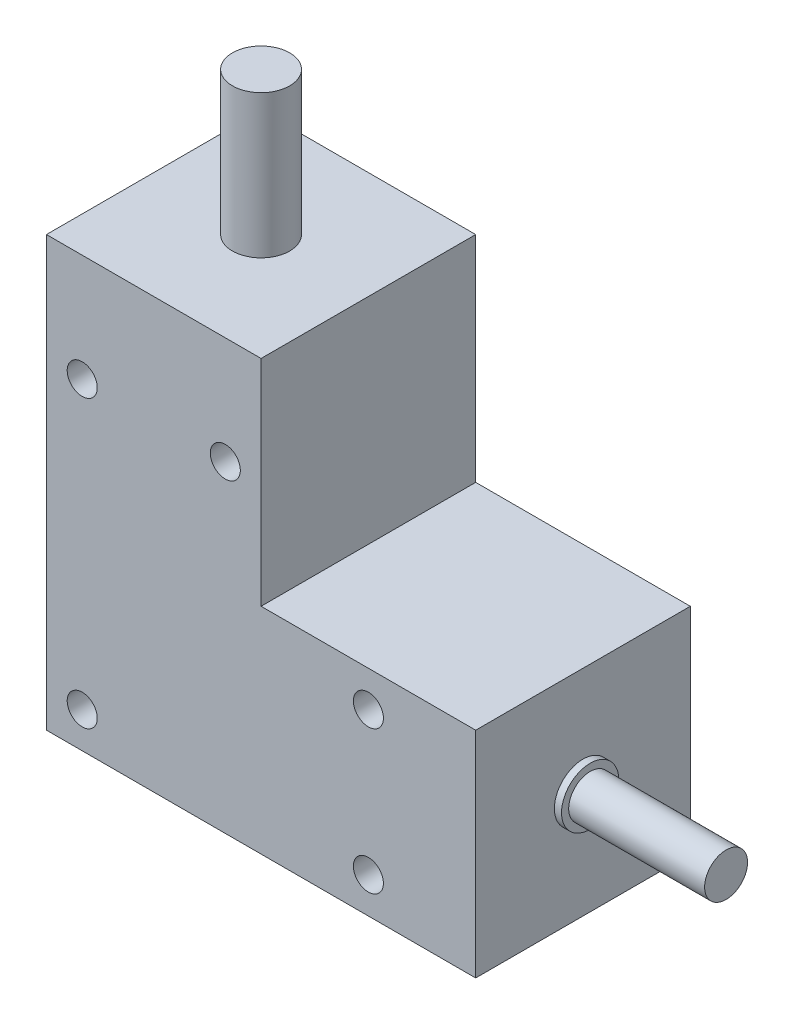
ISO-10303-21;
HEADER;
FILE_DESCRIPTION(('STEP AP214'),'2;1');
FILE_NAME('part.step','',(''),(''),'','','');
FILE_SCHEMA(('AUTOMOTIVE_DESIGN { 1 0 10303 214 1 1 1 1 }'));
ENDSEC;
DATA;
#1=APPLICATION_CONTEXT('core data for automotive mechanical design processes');
#2=APPLICATION_PROTOCOL_DEFINITION('international standard','automotive_design',2000,#1);
#3=PRODUCT_CONTEXT('',#1,'mechanical');
#4=PRODUCT('Part','Part','',(#3));
#5=PRODUCT_RELATED_PRODUCT_CATEGORY('part','',(#4));
#6=PRODUCT_DEFINITION_FORMATION('','',#4);
#7=PRODUCT_DEFINITION_CONTEXT('part definition',#1,'design');
#8=PRODUCT_DEFINITION('design','',#6,#7);
#9=PRODUCT_DEFINITION_SHAPE('','',#8);
#10=(LENGTH_UNIT() NAMED_UNIT(*) SI_UNIT(.MILLI.,.METRE.));
#11=(NAMED_UNIT(*) PLANE_ANGLE_UNIT() SI_UNIT($,.RADIAN.));
#12=(NAMED_UNIT(*) SI_UNIT($,.STERADIAN.) SOLID_ANGLE_UNIT());
#13=UNCERTAINTY_MEASURE_WITH_UNIT(LENGTH_MEASURE(1.E-05),#10,'distance_accuracy_value','');
#14=(GEOMETRIC_REPRESENTATION_CONTEXT(3) GLOBAL_UNCERTAINTY_ASSIGNED_CONTEXT((#13)) GLOBAL_UNIT_ASSIGNED_CONTEXT((#10,
#11,#12)) REPRESENTATION_CONTEXT('',''));
#15=CARTESIAN_POINT('',(0.,0.,0.));
#16=DIRECTION('',(0.,0.,1.));
#17=DIRECTION('',(1.,0.,0.));
#18=AXIS2_PLACEMENT_3D('',#15,#16,#17);
#19=CARTESIAN_POINT('',(80.,15.,0.));
#20=DIRECTION('',(-1.,0.,0.));
#21=DIRECTION('',(0.,0.,1.));
#22=AXIS2_PLACEMENT_3D('',#19,#20,#21);
#23=CYLINDRICAL_SURFACE('',#22,4.);
#24=CARTESIAN_POINT('',(60.,15.,0.));
#25=DIRECTION('',(-1.,0.,0.));
#26=DIRECTION('',(0.,0.,1.));
#27=AXIS2_PLACEMENT_3D('',#24,#25,#26);
#28=CIRCLE('',#27,4.);
#29=CARTESIAN_POINT('',(60.,15.,4.));
#30=VERTEX_POINT('',#29);
#31=EDGE_CURVE('E11',#30,#30,#28,.F.);
#32=ORIENTED_EDGE('',*,*,#31,.T.);
#33=EDGE_LOOP('',(#32));
#34=FACE_BOUND('',#33,.T.);
#35=CARTESIAN_POINT('',(61.,15.,0.));
#36=DIRECTION('',(1.,0.,0.));
#37=DIRECTION('',(0.,0.,-1.));
#38=AXIS2_PLACEMENT_3D('',#35,#36,#37);
#39=CIRCLE('',#38,4.);
#40=CARTESIAN_POINT('',(61.,15.,-4.));
#41=VERTEX_POINT('',#40);
#42=EDGE_CURVE('E267',#41,#41,#39,.T.);
#43=ORIENTED_EDGE('',*,*,#42,.F.);
#44=EDGE_LOOP('',(#43));
#45=FACE_BOUND('',#44,.T.);
#46=ADVANCED_FACE('F36',(#34,#45),#23,.T.);
#47=CARTESIAN_POINT('',(60.,30.,15.));
#48=DIRECTION('',(-1.,0.,0.));
#49=DIRECTION('',(0.,0.,1.));
#50=AXIS2_PLACEMENT_3D('',#47,#48,#49);
#51=PLANE('',#50);
#52=DIRECTION('',(0.,1.,0.));
#53=VECTOR('',#52,1.);
#54=CARTESIAN_POINT('',(60.,30.,-15.));
#55=LINE('',#54,#53);
#56=CARTESIAN_POINT('',(60.,0.,-15.));
#57=VERTEX_POINT('',#56);
#58=CARTESIAN_POINT('',(60.,30.,-15.));
#59=VERTEX_POINT('',#58);
#60=EDGE_CURVE('E131',#57,#59,#55,.T.);
#61=ORIENTED_EDGE('',*,*,#60,.T.);
#62=DIRECTION('',(0.,0.,-1.));
#63=VECTOR('',#62,1.);
#64=CARTESIAN_POINT('',(60.,30.,15.));
#65=LINE('',#64,#63);
#66=CARTESIAN_POINT('',(60.,30.,15.));
#67=VERTEX_POINT('',#66);
#68=EDGE_CURVE('E116',#67,#59,#65,.T.);
#69=ORIENTED_EDGE('',*,*,#68,.F.);
#70=DIRECTION('',(0.,1.,0.));
#71=VECTOR('',#70,1.);
#72=CARTESIAN_POINT('',(60.,30.,15.));
#73=LINE('',#72,#71);
#74=CARTESIAN_POINT('',(60.,0.,15.));
#75=VERTEX_POINT('',#74);
#76=EDGE_CURVE('E107',#75,#67,#73,.T.);
#77=ORIENTED_EDGE('',*,*,#76,.F.);
#78=DIRECTION('',(0.,0.,-1.));
#79=VECTOR('',#78,1.);
#80=CARTESIAN_POINT('',(60.,0.,15.));
#81=LINE('',#80,#79);
#82=EDGE_CURVE('E140',#75,#57,#81,.T.);
#83=ORIENTED_EDGE('',*,*,#82,.T.);
#84=EDGE_LOOP('',(#61,#69,#77,#83));
#85=FACE_BOUND('',#84,.T.);
#86=ORIENTED_EDGE('',*,*,#31,.F.);
#87=EDGE_LOOP('',(#86));
#88=FACE_BOUND('',#87,.T.);
#89=ADVANCED_FACE('F151',(#85,#88),#51,.F.);
#90=CARTESIAN_POINT('',(0.,60.,15.));
#91=DIRECTION('',(0.,-1.,0.));
#92=DIRECTION('',(0.,0.,-1.));
#93=AXIS2_PLACEMENT_3D('',#90,#91,#92);
#94=PLANE('',#93);
#95=DIRECTION('',(-1.,0.,0.));
#96=VECTOR('',#95,1.);
#97=CARTESIAN_POINT('',(0.,60.,-15.));
#98=LINE('',#97,#96);
#99=CARTESIAN_POINT('',(30.,60.,-15.));
#100=VERTEX_POINT('',#99);
#101=CARTESIAN_POINT('',(0.,60.,-15.));
#102=VERTEX_POINT('',#101);
#103=EDGE_CURVE('E83',#100,#102,#98,.T.);
#104=ORIENTED_EDGE('',*,*,#103,.T.);
#105=DIRECTION('',(0.,0.,-1.));
#106=VECTOR('',#105,1.);
#107=CARTESIAN_POINT('',(0.,60.,15.));
#108=LINE('',#107,#106);
#109=CARTESIAN_POINT('',(0.,60.,15.));
#110=VERTEX_POINT('',#109);
#111=EDGE_CURVE('E121',#110,#102,#108,.T.);
#112=ORIENTED_EDGE('',*,*,#111,.F.);
#113=DIRECTION('',(-1.,0.,0.));
#114=VECTOR('',#113,1.);
#115=CARTESIAN_POINT('',(0.,60.,15.));
#116=LINE('',#115,#114);
#117=CARTESIAN_POINT('',(30.,60.,15.));
#118=VERTEX_POINT('',#117);
#119=EDGE_CURVE('E53',#118,#110,#116,.T.);
#120=ORIENTED_EDGE('',*,*,#119,.F.);
#121=DIRECTION('',(0.,0.,-1.));
#122=VECTOR('',#121,1.);
#123=CARTESIAN_POINT('',(30.,60.,15.));
#124=LINE('',#123,#122);
#125=EDGE_CURVE('E117',#118,#100,#124,.T.);
#126=ORIENTED_EDGE('',*,*,#125,.T.);
#127=EDGE_LOOP('',(#104,#112,#120,#126));
#128=FACE_BOUND('',#127,.T.);
#129=CARTESIAN_POINT('',(15.,60.,0.));
#130=DIRECTION('',(0.,-1.,0.));
#131=DIRECTION('',(0.,0.,-1.));
#132=AXIS2_PLACEMENT_3D('',#129,#130,#131);
#133=CIRCLE('',#132,4.);
#134=CARTESIAN_POINT('',(15.,60.,-4.));
#135=VERTEX_POINT('',#134);
#136=EDGE_CURVE('E45',#135,#135,#133,.F.);
#137=ORIENTED_EDGE('',*,*,#136,.F.);
#138=EDGE_LOOP('',(#137));
#139=FACE_BOUND('',#138,.T.);
#140=ADVANCED_FACE('F149',(#128,#139),#94,.F.);
#141=CARTESIAN_POINT('',(0.,0.,15.));
#142=DIRECTION('',(1.,0.,0.));
#143=DIRECTION('',(0.,0.,-1.));
#144=AXIS2_PLACEMENT_3D('',#141,#142,#143);
#145=PLANE('',#144);
#146=DIRECTION('',(0.,-1.,0.));
#147=VECTOR('',#146,1.);
#148=CARTESIAN_POINT('',(0.,0.,-15.));
#149=LINE('',#148,#147);
#150=CARTESIAN_POINT('',(0.,0.,-15.));
#151=VERTEX_POINT('',#150);
#152=EDGE_CURVE('E125',#102,#151,#149,.T.);
#153=ORIENTED_EDGE('',*,*,#152,.T.);
#154=DIRECTION('',(0.,0.,-1.));
#155=VECTOR('',#154,1.);
#156=CARTESIAN_POINT('',(0.,0.,15.));
#157=LINE('',#156,#155);
#158=CARTESIAN_POINT('',(0.,0.,15.));
#159=VERTEX_POINT('',#158);
#160=EDGE_CURVE('E143',#159,#151,#157,.T.);
#161=ORIENTED_EDGE('',*,*,#160,.F.);
#162=DIRECTION('',(0.,-1.,0.));
#163=VECTOR('',#162,1.);
#164=CARTESIAN_POINT('',(0.,0.,15.));
#165=LINE('',#164,#163);
#166=EDGE_CURVE('E136',#110,#159,#165,.T.);
#167=ORIENTED_EDGE('',*,*,#166,.F.);
#168=ORIENTED_EDGE('',*,*,#111,.T.);
#169=EDGE_LOOP('',(#153,#161,#167,#168));
#170=FACE_BOUND('',#169,.T.);
#171=ADVANCED_FACE('F38',(#170),#145,.F.);
#172=CARTESIAN_POINT('',(60.,0.,15.));
#173=DIRECTION('',(0.,1.,0.));
#174=DIRECTION('',(-1.,0.,0.));
#175=AXIS2_PLACEMENT_3D('',#172,#173,#174);
#176=PLANE('',#175);
#177=DIRECTION('',(1.,0.,0.));
#178=VECTOR('',#177,1.);
#179=CARTESIAN_POINT('',(60.,0.,-15.));
#180=LINE('',#179,#178);
#181=EDGE_CURVE('E128',#151,#57,#180,.T.);
#182=ORIENTED_EDGE('',*,*,#181,.T.);
#183=ORIENTED_EDGE('',*,*,#82,.F.);
#184=DIRECTION('',(1.,0.,0.));
#185=VECTOR('',#184,1.);
#186=CARTESIAN_POINT('',(60.,0.,15.));
#187=LINE('',#186,#185);
#188=EDGE_CURVE('E92',#159,#75,#187,.T.);
#189=ORIENTED_EDGE('',*,*,#188,.F.);
#190=ORIENTED_EDGE('',*,*,#160,.T.);
#191=EDGE_LOOP('',(#182,#183,#189,#190));
#192=FACE_BOUND('',#191,.T.);
#193=ADVANCED_FACE('F157',(#192),#176,.F.);
#194=CARTESIAN_POINT('',(30.,30.,15.));
#195=DIRECTION('',(0.,-1.,0.));
#196=DIRECTION('',(1.,0.,0.));
#197=AXIS2_PLACEMENT_3D('',#194,#195,#196);
#198=PLANE('',#197);
#199=DIRECTION('',(-1.,0.,0.));
#200=VECTOR('',#199,1.);
#201=CARTESIAN_POINT('',(30.,30.,-15.));
#202=LINE('',#201,#200);
#203=CARTESIAN_POINT('',(30.,30.,-15.));
#204=VERTEX_POINT('',#203);
#205=EDGE_CURVE('E115',#59,#204,#202,.T.);
#206=ORIENTED_EDGE('',*,*,#205,.T.);
#207=DIRECTION('',(0.,0.,-1.));
#208=VECTOR('',#207,1.);
#209=CARTESIAN_POINT('',(30.,30.,15.));
#210=LINE('',#209,#208);
#211=CARTESIAN_POINT('',(30.,30.,15.));
#212=VERTEX_POINT('',#211);
#213=EDGE_CURVE('E112',#212,#204,#210,.T.);
#214=ORIENTED_EDGE('',*,*,#213,.F.);
#215=DIRECTION('',(-1.,0.,0.));
#216=VECTOR('',#215,1.);
#217=CARTESIAN_POINT('',(30.,30.,15.));
#218=LINE('',#217,#216);
#219=EDGE_CURVE('E101',#67,#212,#218,.T.);
#220=ORIENTED_EDGE('',*,*,#219,.F.);
#221=ORIENTED_EDGE('',*,*,#68,.T.);
#222=EDGE_LOOP('',(#206,#214,#220,#221));
#223=FACE_BOUND('',#222,.T.);
#224=ADVANCED_FACE('F113',(#223),#198,.F.);
#225=CARTESIAN_POINT('',(30.,60.,15.));
#226=DIRECTION('',(-1.,0.,0.));
#227=DIRECTION('',(0.,-1.,0.));
#228=AXIS2_PLACEMENT_3D('',#225,#226,#227);
#229=PLANE('',#228);
#230=DIRECTION('',(0.,1.,0.));
#231=VECTOR('',#230,1.);
#232=CARTESIAN_POINT('',(30.,60.,-15.));
#233=LINE('',#232,#231);
#234=EDGE_CURVE('E77',#204,#100,#233,.T.);
#235=ORIENTED_EDGE('',*,*,#234,.T.);
#236=ORIENTED_EDGE('',*,*,#125,.F.);
#237=DIRECTION('',(0.,1.,0.));
#238=VECTOR('',#237,1.);
#239=CARTESIAN_POINT('',(30.,60.,15.));
#240=LINE('',#239,#238);
#241=EDGE_CURVE('E105',#212,#118,#240,.T.);
#242=ORIENTED_EDGE('',*,*,#241,.F.);
#243=ORIENTED_EDGE('',*,*,#213,.T.);
#244=EDGE_LOOP('',(#235,#236,#242,#243));
#245=FACE_BOUND('',#244,.T.);
#246=ADVANCED_FACE('F119',(#245),#229,.F.);
#247=CARTESIAN_POINT('',(0.,60.,15.));
#248=DIRECTION('',(0.,0.,-1.));
#249=DIRECTION('',(-1.,0.,0.));
#250=AXIS2_PLACEMENT_3D('',#247,#248,#249);
#251=PLANE('',#250);
#252=CARTESIAN_POINT('',(25.,45.,15.));
#253=DIRECTION('',(0.,0.,1.));
#254=DIRECTION('',(1.,0.,0.));
#255=AXIS2_PLACEMENT_3D('',#252,#253,#254);
#256=CIRCLE('',#255,2.09999999999999);
#257=CARTESIAN_POINT('',(27.1,45.,15.));
#258=VERTEX_POINT('',#257);
#259=EDGE_CURVE('E244',#258,#258,#256,.T.);
#260=ORIENTED_EDGE('',*,*,#259,.F.);
#261=EDGE_LOOP('',(#260));
#262=FACE_BOUND('',#261,.T.);
#263=CARTESIAN_POINT('',(5.,5.,15.));
#264=DIRECTION('',(0.,0.,1.));
#265=DIRECTION('',(1.,0.,0.));
#266=AXIS2_PLACEMENT_3D('',#263,#264,#265);
#267=CIRCLE('',#266,2.09999999999999);
#268=CARTESIAN_POINT('',(7.09999999999999,5.,15.));
#269=VERTEX_POINT('',#268);
#270=EDGE_CURVE('E238',#269,#269,#267,.T.);
#271=ORIENTED_EDGE('',*,*,#270,.F.);
#272=EDGE_LOOP('',(#271));
#273=FACE_BOUND('',#272,.T.);
#274=CARTESIAN_POINT('',(5.,45.,15.));
#275=DIRECTION('',(0.,0.,1.));
#276=DIRECTION('',(1.,0.,0.));
#277=AXIS2_PLACEMENT_3D('',#274,#275,#276);
#278=CIRCLE('',#277,2.09999999999999);
#279=CARTESIAN_POINT('',(7.09999999999999,45.,15.));
#280=VERTEX_POINT('',#279);
#281=EDGE_CURVE('E232',#280,#280,#278,.T.);
#282=ORIENTED_EDGE('',*,*,#281,.F.);
#283=EDGE_LOOP('',(#282));
#284=FACE_BOUND('',#283,.T.);
#285=CARTESIAN_POINT('',(45.,25.,15.));
#286=DIRECTION('',(0.,0.,1.));
#287=DIRECTION('',(1.,0.,0.));
#288=AXIS2_PLACEMENT_3D('',#285,#286,#287);
#289=CIRCLE('',#288,2.09999999999999);
#290=CARTESIAN_POINT('',(47.1,25.,15.));
#291=VERTEX_POINT('',#290);
#292=EDGE_CURVE('E226',#291,#291,#289,.T.);
#293=ORIENTED_EDGE('',*,*,#292,.F.);
#294=EDGE_LOOP('',(#293));
#295=FACE_BOUND('',#294,.T.);
#296=CARTESIAN_POINT('',(45.,5.00000000000001,15.));
#297=DIRECTION('',(0.,0.,1.));
#298=DIRECTION('',(1.,0.,0.));
#299=AXIS2_PLACEMENT_3D('',#296,#297,#298);
#300=CIRCLE('',#299,2.09999999999999);
#301=CARTESIAN_POINT('',(47.1,5.00000000000001,15.));
#302=VERTEX_POINT('',#301);
#303=EDGE_CURVE('E220',#302,#302,#300,.T.);
#304=ORIENTED_EDGE('',*,*,#303,.F.);
#305=EDGE_LOOP('',(#304));
#306=FACE_BOUND('',#305,.T.);
#307=ORIENTED_EDGE('',*,*,#166,.T.);
#308=ORIENTED_EDGE('',*,*,#188,.T.);
#309=ORIENTED_EDGE('',*,*,#76,.T.);
#310=ORIENTED_EDGE('',*,*,#219,.T.);
#311=ORIENTED_EDGE('',*,*,#241,.T.);
#312=ORIENTED_EDGE('',*,*,#119,.T.);
#313=EDGE_LOOP('',(#307,#308,#309,#310,#311,#312));
#314=FACE_BOUND('',#313,.T.);
#315=ADVANCED_FACE('F103',(#262,#273,#284,#295,#306,#314),#251,.F.);
#316=CARTESIAN_POINT('',(0.,60.,-15.));
#317=DIRECTION('',(0.,0.,-1.));
#318=DIRECTION('',(-1.,0.,0.));
#319=AXIS2_PLACEMENT_3D('',#316,#317,#318);
#320=PLANE('',#319);
#321=CARTESIAN_POINT('',(25.,45.,-15.));
#322=DIRECTION('',(0.,0.,-1.));
#323=DIRECTION('',(-1.,0.,0.));
#324=AXIS2_PLACEMENT_3D('',#321,#322,#323);
#325=CIRCLE('',#324,2.09999999999999);
#326=CARTESIAN_POINT('',(22.9,45.,-15.));
#327=VERTEX_POINT('',#326);
#328=EDGE_CURVE('E191',#327,#327,#325,.T.);
#329=ORIENTED_EDGE('',*,*,#328,.F.);
#330=EDGE_LOOP('',(#329));
#331=FACE_BOUND('',#330,.T.);
#332=CARTESIAN_POINT('',(5.,5.,-15.));
#333=DIRECTION('',(0.,0.,-1.));
#334=DIRECTION('',(-1.,0.,0.));
#335=AXIS2_PLACEMENT_3D('',#332,#333,#334);
#336=CIRCLE('',#335,2.09999999999999);
#337=CARTESIAN_POINT('',(2.90000000000001,5.,-15.));
#338=VERTEX_POINT('',#337);
#339=EDGE_CURVE('E195',#338,#338,#336,.T.);
#340=ORIENTED_EDGE('',*,*,#339,.F.);
#341=EDGE_LOOP('',(#340));
#342=FACE_BOUND('',#341,.T.);
#343=CARTESIAN_POINT('',(5.,45.,-15.));
#344=DIRECTION('',(0.,0.,-1.));
#345=DIRECTION('',(-1.,0.,0.));
#346=AXIS2_PLACEMENT_3D('',#343,#344,#345);
#347=CIRCLE('',#346,2.09999999999999);
#348=CARTESIAN_POINT('',(2.90000000000001,45.,-15.));
#349=VERTEX_POINT('',#348);
#350=EDGE_CURVE('E199',#349,#349,#347,.T.);
#351=ORIENTED_EDGE('',*,*,#350,.F.);
#352=EDGE_LOOP('',(#351));
#353=FACE_BOUND('',#352,.T.);
#354=CARTESIAN_POINT('',(45.,25.,-15.));
#355=DIRECTION('',(0.,0.,-1.));
#356=DIRECTION('',(-1.,0.,0.));
#357=AXIS2_PLACEMENT_3D('',#354,#355,#356);
#358=CIRCLE('',#357,2.09999999999999);
#359=CARTESIAN_POINT('',(42.9,25.,-15.));
#360=VERTEX_POINT('',#359);
#361=EDGE_CURVE('E203',#360,#360,#358,.T.);
#362=ORIENTED_EDGE('',*,*,#361,.F.);
#363=EDGE_LOOP('',(#362));
#364=FACE_BOUND('',#363,.T.);
#365=CARTESIAN_POINT('',(45.,5.00000000000001,-15.));
#366=DIRECTION('',(0.,0.,-1.));
#367=DIRECTION('',(-1.,0.,0.));
#368=AXIS2_PLACEMENT_3D('',#365,#366,#367);
#369=CIRCLE('',#368,2.09999999999999);
#370=CARTESIAN_POINT('',(42.9,5.00000000000001,-15.));
#371=VERTEX_POINT('',#370);
#372=EDGE_CURVE('E207',#371,#371,#369,.T.);
#373=ORIENTED_EDGE('',*,*,#372,.F.);
#374=EDGE_LOOP('',(#373));
#375=FACE_BOUND('',#374,.T.);
#376=ORIENTED_EDGE('',*,*,#152,.F.);
#377=ORIENTED_EDGE('',*,*,#103,.F.);
#378=ORIENTED_EDGE('',*,*,#234,.F.);
#379=ORIENTED_EDGE('',*,*,#205,.F.);
#380=ORIENTED_EDGE('',*,*,#60,.F.);
#381=ORIENTED_EDGE('',*,*,#181,.F.);
#382=EDGE_LOOP('',(#376,#377,#378,#379,#380,#381));
#383=FACE_BOUND('',#382,.T.);
#384=ADVANCED_FACE('F180',(#331,#342,#353,#364,#375,#383),#320,.T.);
#385=CARTESIAN_POINT('',(15.,80.,0.));
#386=DIRECTION('',(0.,-1.,0.));
#387=DIRECTION('',(0.,0.,-1.));
#388=AXIS2_PLACEMENT_3D('',#385,#386,#387);
#389=CYLINDRICAL_SURFACE('',#388,4.);
#390=CARTESIAN_POINT('',(15.,80.,0.));
#391=DIRECTION('',(0.,1.,0.));
#392=DIRECTION('',(0.,0.,1.));
#393=AXIS2_PLACEMENT_3D('',#390,#391,#392);
#394=CIRCLE('',#393,4.);
#395=CARTESIAN_POINT('',(15.,80.,4.));
#396=VERTEX_POINT('',#395);
#397=EDGE_CURVE('E129',#396,#396,#394,.T.);
#398=ORIENTED_EDGE('',*,*,#397,.F.);
#399=EDGE_LOOP('',(#398));
#400=FACE_BOUND('',#399,.T.);
#401=ORIENTED_EDGE('',*,*,#136,.T.);
#402=EDGE_LOOP('',(#401));
#403=FACE_BOUND('',#402,.T.);
#404=ADVANCED_FACE('F147',(#400,#403),#389,.T.);
#405=CARTESIAN_POINT('',(15.,80.,0.));
#406=DIRECTION('',(0.,1.,0.));
#407=DIRECTION('',(0.,0.,1.));
#408=AXIS2_PLACEMENT_3D('',#405,#406,#407);
#409=PLANE('',#408);
#410=ORIENTED_EDGE('',*,*,#397,.T.);
#411=EDGE_LOOP('',(#410));
#412=FACE_BOUND('',#411,.T.);
#413=ADVANCED_FACE('F173',(#412),#409,.T.);
#414=CARTESIAN_POINT('',(45.,5.00000000000001,8.));
#415=DIRECTION('',(0.,0.,1.));
#416=DIRECTION('',(1.,0.,0.));
#417=AXIS2_PLACEMENT_3D('',#414,#415,#416);
#418=CONICAL_SURFACE('',#417,2.1,1.02974425867665);
#419=CARTESIAN_POINT('',(45.,5.00000000000001,6.73819270004212));
#420=VERTEX_POINT('',#419);
#421=VERTEX_LOOP('',#420);
#422=FACE_BOUND('',#421,.T.);
#423=CARTESIAN_POINT('',(45.,5.00000000000001,8.));
#424=DIRECTION('',(0.,0.,1.));
#425=DIRECTION('',(1.,0.,0.));
#426=AXIS2_PLACEMENT_3D('',#423,#424,#425);
#427=CIRCLE('',#426,2.1);
#428=CARTESIAN_POINT('',(47.1,5.00000000000001,8.));
#429=VERTEX_POINT('',#428);
#430=EDGE_CURVE('E217',#429,#429,#427,.T.);
#431=ORIENTED_EDGE('',*,*,#430,.T.);
#432=EDGE_LOOP('',(#431));
#433=FACE_BOUND('',#432,.T.);
#434=ADVANCED_FACE('F176',(#422,#433),#418,.F.);
#435=CARTESIAN_POINT('',(45.,5.00000000000001,15.));
#436=DIRECTION('',(0.,0.,1.));
#437=DIRECTION('',(1.,0.,0.));
#438=AXIS2_PLACEMENT_3D('',#435,#436,#437);
#439=CYLINDRICAL_SURFACE('',#438,2.09999999999999);
#440=ORIENTED_EDGE('',*,*,#430,.F.);
#441=EDGE_LOOP('',(#440));
#442=FACE_BOUND('',#441,.T.);
#443=ORIENTED_EDGE('',*,*,#303,.T.);
#444=EDGE_LOOP('',(#443));
#445=FACE_BOUND('',#444,.T.);
#446=ADVANCED_FACE('F361',(#442,#445),#439,.F.);
#447=CARTESIAN_POINT('',(45.,25.,8.));
#448=DIRECTION('',(0.,0.,1.));
#449=DIRECTION('',(1.,0.,0.));
#450=AXIS2_PLACEMENT_3D('',#447,#448,#449);
#451=CONICAL_SURFACE('',#450,2.1,1.02974425867665);
#452=CARTESIAN_POINT('',(45.,25.,6.73819270004212));
#453=VERTEX_POINT('',#452);
#454=VERTEX_LOOP('',#453);
#455=FACE_BOUND('',#454,.T.);
#456=CARTESIAN_POINT('',(45.,25.,8.));
#457=DIRECTION('',(0.,0.,1.));
#458=DIRECTION('',(1.,0.,0.));
#459=AXIS2_PLACEMENT_3D('',#456,#457,#458);
#460=CIRCLE('',#459,2.1);
#461=CARTESIAN_POINT('',(47.1,25.,8.));
#462=VERTEX_POINT('',#461);
#463=EDGE_CURVE('E223',#462,#462,#460,.T.);
#464=ORIENTED_EDGE('',*,*,#463,.T.);
#465=EDGE_LOOP('',(#464));
#466=FACE_BOUND('',#465,.T.);
#467=ADVANCED_FACE('F357',(#455,#466),#451,.F.);
#468=CARTESIAN_POINT('',(45.,25.,15.));
#469=DIRECTION('',(0.,0.,1.));
#470=DIRECTION('',(1.,0.,0.));
#471=AXIS2_PLACEMENT_3D('',#468,#469,#470);
#472=CYLINDRICAL_SURFACE('',#471,2.09999999999999);
#473=ORIENTED_EDGE('',*,*,#463,.F.);
#474=EDGE_LOOP('',(#473));
#475=FACE_BOUND('',#474,.T.);
#476=ORIENTED_EDGE('',*,*,#292,.T.);
#477=EDGE_LOOP('',(#476));
#478=FACE_BOUND('',#477,.T.);
#479=ADVANCED_FACE('F353',(#475,#478),#472,.F.);
#480=CARTESIAN_POINT('',(5.,45.,8.));
#481=DIRECTION('',(0.,0.,1.));
#482=DIRECTION('',(1.,0.,0.));
#483=AXIS2_PLACEMENT_3D('',#480,#481,#482);
#484=CONICAL_SURFACE('',#483,2.1,1.02974425867665);
#485=CARTESIAN_POINT('',(5.,45.,6.73819270004212));
#486=VERTEX_POINT('',#485);
#487=VERTEX_LOOP('',#486);
#488=FACE_BOUND('',#487,.T.);
#489=CARTESIAN_POINT('',(5.,45.,8.));
#490=DIRECTION('',(0.,0.,1.));
#491=DIRECTION('',(1.,0.,0.));
#492=AXIS2_PLACEMENT_3D('',#489,#490,#491);
#493=CIRCLE('',#492,2.1);
#494=CARTESIAN_POINT('',(7.1,45.,8.));
#495=VERTEX_POINT('',#494);
#496=EDGE_CURVE('E229',#495,#495,#493,.T.);
#497=ORIENTED_EDGE('',*,*,#496,.T.);
#498=EDGE_LOOP('',(#497));
#499=FACE_BOUND('',#498,.T.);
#500=ADVANCED_FACE('F349',(#488,#499),#484,.F.);
#501=CARTESIAN_POINT('',(5.,45.,15.));
#502=DIRECTION('',(0.,0.,1.));
#503=DIRECTION('',(1.,0.,0.));
#504=AXIS2_PLACEMENT_3D('',#501,#502,#503);
#505=CYLINDRICAL_SURFACE('',#504,2.09999999999999);
#506=ORIENTED_EDGE('',*,*,#496,.F.);
#507=EDGE_LOOP('',(#506));
#508=FACE_BOUND('',#507,.T.);
#509=ORIENTED_EDGE('',*,*,#281,.T.);
#510=EDGE_LOOP('',(#509));
#511=FACE_BOUND('',#510,.T.);
#512=ADVANCED_FACE('F345',(#508,#511),#505,.F.);
#513=CARTESIAN_POINT('',(5.,5.,8.));
#514=DIRECTION('',(0.,0.,1.));
#515=DIRECTION('',(1.,0.,0.));
#516=AXIS2_PLACEMENT_3D('',#513,#514,#515);
#517=CONICAL_SURFACE('',#516,2.1,1.02974425867665);
#518=CARTESIAN_POINT('',(5.,5.,6.73819270004212));
#519=VERTEX_POINT('',#518);
#520=VERTEX_LOOP('',#519);
#521=FACE_BOUND('',#520,.T.);
#522=CARTESIAN_POINT('',(5.,5.,8.));
#523=DIRECTION('',(0.,0.,1.));
#524=DIRECTION('',(1.,0.,0.));
#525=AXIS2_PLACEMENT_3D('',#522,#523,#524);
#526=CIRCLE('',#525,2.1);
#527=CARTESIAN_POINT('',(7.1,5.,8.));
#528=VERTEX_POINT('',#527);
#529=EDGE_CURVE('E235',#528,#528,#526,.T.);
#530=ORIENTED_EDGE('',*,*,#529,.T.);
#531=EDGE_LOOP('',(#530));
#532=FACE_BOUND('',#531,.T.);
#533=ADVANCED_FACE('F341',(#521,#532),#517,.F.);
#534=CARTESIAN_POINT('',(5.,5.,15.));
#535=DIRECTION('',(0.,0.,1.));
#536=DIRECTION('',(1.,0.,0.));
#537=AXIS2_PLACEMENT_3D('',#534,#535,#536);
#538=CYLINDRICAL_SURFACE('',#537,2.09999999999999);
#539=ORIENTED_EDGE('',*,*,#529,.F.);
#540=EDGE_LOOP('',(#539));
#541=FACE_BOUND('',#540,.T.);
#542=ORIENTED_EDGE('',*,*,#270,.T.);
#543=EDGE_LOOP('',(#542));
#544=FACE_BOUND('',#543,.T.);
#545=ADVANCED_FACE('F337',(#541,#544),#538,.F.);
#546=CARTESIAN_POINT('',(25.,45.,8.));
#547=DIRECTION('',(0.,0.,1.));
#548=DIRECTION('',(1.,0.,0.));
#549=AXIS2_PLACEMENT_3D('',#546,#547,#548);
#550=CONICAL_SURFACE('',#549,2.1,1.02974425867665);
#551=CARTESIAN_POINT('',(25.,45.,6.73819270004212));
#552=VERTEX_POINT('',#551);
#553=VERTEX_LOOP('',#552);
#554=FACE_BOUND('',#553,.T.);
#555=CARTESIAN_POINT('',(25.,45.,8.));
#556=DIRECTION('',(0.,0.,1.));
#557=DIRECTION('',(1.,0.,0.));
#558=AXIS2_PLACEMENT_3D('',#555,#556,#557);
#559=CIRCLE('',#558,2.1);
#560=CARTESIAN_POINT('',(27.1,45.,8.));
#561=VERTEX_POINT('',#560);
#562=EDGE_CURVE('E241',#561,#561,#559,.T.);
#563=ORIENTED_EDGE('',*,*,#562,.T.);
#564=EDGE_LOOP('',(#563));
#565=FACE_BOUND('',#564,.T.);
#566=ADVANCED_FACE('F333',(#554,#565),#550,.F.);
#567=CARTESIAN_POINT('',(25.,45.,15.));
#568=DIRECTION('',(0.,0.,1.));
#569=DIRECTION('',(1.,0.,0.));
#570=AXIS2_PLACEMENT_3D('',#567,#568,#569);
#571=CYLINDRICAL_SURFACE('',#570,2.09999999999999);
#572=ORIENTED_EDGE('',*,*,#562,.F.);
#573=EDGE_LOOP('',(#572));
#574=FACE_BOUND('',#573,.T.);
#575=ORIENTED_EDGE('',*,*,#259,.T.);
#576=EDGE_LOOP('',(#575));
#577=FACE_BOUND('',#576,.T.);
#578=ADVANCED_FACE('F329',(#574,#577),#571,.F.);
#579=CARTESIAN_POINT('',(45.,5.00000000000001,-8.));
#580=DIRECTION('',(0.,0.,-1.));
#581=DIRECTION('',(-1.,0.,0.));
#582=AXIS2_PLACEMENT_3D('',#579,#580,#581);
#583=CONICAL_SURFACE('',#582,2.1,1.02974425867665);
#584=CARTESIAN_POINT('',(45.,5.00000000000001,-6.73819270004212));
#585=VERTEX_POINT('',#584);
#586=VERTEX_LOOP('',#585);
#587=FACE_BOUND('',#586,.T.);
#588=CARTESIAN_POINT('',(45.,5.00000000000001,-8.));
#589=DIRECTION('',(0.,0.,-1.));
#590=DIRECTION('',(-1.,0.,0.));
#591=AXIS2_PLACEMENT_3D('',#588,#589,#590);
#592=CIRCLE('',#591,2.1);
#593=CARTESIAN_POINT('',(42.9,5.00000000000001,-8.));
#594=VERTEX_POINT('',#593);
#595=EDGE_CURVE('E247',#594,#594,#592,.T.);
#596=ORIENTED_EDGE('',*,*,#595,.T.);
#597=EDGE_LOOP('',(#596));
#598=FACE_BOUND('',#597,.T.);
#599=ADVANCED_FACE('F325',(#587,#598),#583,.F.);
#600=CARTESIAN_POINT('',(45.,5.00000000000001,-15.));
#601=DIRECTION('',(0.,0.,-1.));
#602=DIRECTION('',(-1.,0.,0.));
#603=AXIS2_PLACEMENT_3D('',#600,#601,#602);
#604=CYLINDRICAL_SURFACE('',#603,2.09999999999999);
#605=ORIENTED_EDGE('',*,*,#595,.F.);
#606=EDGE_LOOP('',(#605));
#607=FACE_BOUND('',#606,.T.);
#608=ORIENTED_EDGE('',*,*,#372,.T.);
#609=EDGE_LOOP('',(#608));
#610=FACE_BOUND('',#609,.T.);
#611=ADVANCED_FACE('F321',(#607,#610),#604,.F.);
#612=CARTESIAN_POINT('',(45.,25.,-8.));
#613=DIRECTION('',(0.,0.,-1.));
#614=DIRECTION('',(-1.,0.,0.));
#615=AXIS2_PLACEMENT_3D('',#612,#613,#614);
#616=CONICAL_SURFACE('',#615,2.1,1.02974425867665);
#617=CARTESIAN_POINT('',(45.,25.,-6.73819270004212));
#618=VERTEX_POINT('',#617);
#619=VERTEX_LOOP('',#618);
#620=FACE_BOUND('',#619,.T.);
#621=CARTESIAN_POINT('',(45.,25.,-8.));
#622=DIRECTION('',(0.,0.,-1.));
#623=DIRECTION('',(-1.,0.,0.));
#624=AXIS2_PLACEMENT_3D('',#621,#622,#623);
#625=CIRCLE('',#624,2.1);
#626=CARTESIAN_POINT('',(42.9,25.,-8.));
#627=VERTEX_POINT('',#626);
#628=EDGE_CURVE('E251',#627,#627,#625,.T.);
#629=ORIENTED_EDGE('',*,*,#628,.T.);
#630=EDGE_LOOP('',(#629));
#631=FACE_BOUND('',#630,.T.);
#632=ADVANCED_FACE('F317',(#620,#631),#616,.F.);
#633=CARTESIAN_POINT('',(45.,25.,-15.));
#634=DIRECTION('',(0.,0.,-1.));
#635=DIRECTION('',(-1.,0.,0.));
#636=AXIS2_PLACEMENT_3D('',#633,#634,#635);
#637=CYLINDRICAL_SURFACE('',#636,2.09999999999999);
#638=ORIENTED_EDGE('',*,*,#628,.F.);
#639=EDGE_LOOP('',(#638));
#640=FACE_BOUND('',#639,.T.);
#641=ORIENTED_EDGE('',*,*,#361,.T.);
#642=EDGE_LOOP('',(#641));
#643=FACE_BOUND('',#642,.T.);
#644=ADVANCED_FACE('F313',(#640,#643),#637,.F.);
#645=CARTESIAN_POINT('',(5.,45.,-8.));
#646=DIRECTION('',(0.,0.,-1.));
#647=DIRECTION('',(-1.,0.,0.));
#648=AXIS2_PLACEMENT_3D('',#645,#646,#647);
#649=CONICAL_SURFACE('',#648,2.1,1.02974425867665);
#650=CARTESIAN_POINT('',(5.,45.,-6.73819270004212));
#651=VERTEX_POINT('',#650);
#652=VERTEX_LOOP('',#651);
#653=FACE_BOUND('',#652,.T.);
#654=CARTESIAN_POINT('',(5.,45.,-8.));
#655=DIRECTION('',(0.,0.,-1.));
#656=DIRECTION('',(-1.,0.,0.));
#657=AXIS2_PLACEMENT_3D('',#654,#655,#656);
#658=CIRCLE('',#657,2.1);
#659=CARTESIAN_POINT('',(2.9,45.,-8.));
#660=VERTEX_POINT('',#659);
#661=EDGE_CURVE('E255',#660,#660,#658,.T.);
#662=ORIENTED_EDGE('',*,*,#661,.T.);
#663=EDGE_LOOP('',(#662));
#664=FACE_BOUND('',#663,.T.);
#665=ADVANCED_FACE('F309',(#653,#664),#649,.F.);
#666=CARTESIAN_POINT('',(5.,45.,-15.));
#667=DIRECTION('',(0.,0.,-1.));
#668=DIRECTION('',(-1.,0.,0.));
#669=AXIS2_PLACEMENT_3D('',#666,#667,#668);
#670=CYLINDRICAL_SURFACE('',#669,2.09999999999999);
#671=ORIENTED_EDGE('',*,*,#661,.F.);
#672=EDGE_LOOP('',(#671));
#673=FACE_BOUND('',#672,.T.);
#674=ORIENTED_EDGE('',*,*,#350,.T.);
#675=EDGE_LOOP('',(#674));
#676=FACE_BOUND('',#675,.T.);
#677=ADVANCED_FACE('F305',(#673,#676),#670,.F.);
#678=CARTESIAN_POINT('',(5.,5.,-8.));
#679=DIRECTION('',(0.,0.,-1.));
#680=DIRECTION('',(-1.,0.,0.));
#681=AXIS2_PLACEMENT_3D('',#678,#679,#680);
#682=CONICAL_SURFACE('',#681,2.1,1.02974425867665);
#683=CARTESIAN_POINT('',(5.,5.,-6.73819270004212));
#684=VERTEX_POINT('',#683);
#685=VERTEX_LOOP('',#684);
#686=FACE_BOUND('',#685,.T.);
#687=CARTESIAN_POINT('',(5.,5.,-8.));
#688=DIRECTION('',(0.,0.,-1.));
#689=DIRECTION('',(-1.,0.,0.));
#690=AXIS2_PLACEMENT_3D('',#687,#688,#689);
#691=CIRCLE('',#690,2.1);
#692=CARTESIAN_POINT('',(2.9,5.,-8.));
#693=VERTEX_POINT('',#692);
#694=EDGE_CURVE('E259',#693,#693,#691,.T.);
#695=ORIENTED_EDGE('',*,*,#694,.T.);
#696=EDGE_LOOP('',(#695));
#697=FACE_BOUND('',#696,.T.);
#698=ADVANCED_FACE('F301',(#686,#697),#682,.F.);
#699=CARTESIAN_POINT('',(5.,5.,-15.));
#700=DIRECTION('',(0.,0.,-1.));
#701=DIRECTION('',(-1.,0.,0.));
#702=AXIS2_PLACEMENT_3D('',#699,#700,#701);
#703=CYLINDRICAL_SURFACE('',#702,2.09999999999999);
#704=ORIENTED_EDGE('',*,*,#694,.F.);
#705=EDGE_LOOP('',(#704));
#706=FACE_BOUND('',#705,.T.);
#707=ORIENTED_EDGE('',*,*,#339,.T.);
#708=EDGE_LOOP('',(#707));
#709=FACE_BOUND('',#708,.T.);
#710=ADVANCED_FACE('F297',(#706,#709),#703,.F.);
#711=CARTESIAN_POINT('',(25.,45.,-8.));
#712=DIRECTION('',(0.,0.,-1.));
#713=DIRECTION('',(-1.,0.,0.));
#714=AXIS2_PLACEMENT_3D('',#711,#712,#713);
#715=CONICAL_SURFACE('',#714,2.1,1.02974425867665);
#716=CARTESIAN_POINT('',(25.,45.,-6.73819270004212));
#717=VERTEX_POINT('',#716);
#718=VERTEX_LOOP('',#717);
#719=FACE_BOUND('',#718,.T.);
#720=CARTESIAN_POINT('',(25.,45.,-8.));
#721=DIRECTION('',(0.,0.,-1.));
#722=DIRECTION('',(-1.,0.,0.));
#723=AXIS2_PLACEMENT_3D('',#720,#721,#722);
#724=CIRCLE('',#723,2.1);
#725=CARTESIAN_POINT('',(22.9,45.,-8.));
#726=VERTEX_POINT('',#725);
#727=EDGE_CURVE('E263',#726,#726,#724,.T.);
#728=ORIENTED_EDGE('',*,*,#727,.T.);
#729=EDGE_LOOP('',(#728));
#730=FACE_BOUND('',#729,.T.);
#731=ADVANCED_FACE('F291',(#719,#730),#715,.F.);
#732=CARTESIAN_POINT('',(25.,45.,-15.));
#733=DIRECTION('',(0.,0.,-1.));
#734=DIRECTION('',(-1.,0.,0.));
#735=AXIS2_PLACEMENT_3D('',#732,#733,#734);
#736=CYLINDRICAL_SURFACE('',#735,2.09999999999999);
#737=ORIENTED_EDGE('',*,*,#727,.F.);
#738=EDGE_LOOP('',(#737));
#739=FACE_BOUND('',#738,.T.);
#740=ORIENTED_EDGE('',*,*,#328,.T.);
#741=EDGE_LOOP('',(#740));
#742=FACE_BOUND('',#741,.T.);
#743=ADVANCED_FACE('F283',(#739,#742),#736,.F.);
#744=CARTESIAN_POINT('',(61.,15.,0.));
#745=DIRECTION('',(1.,0.,0.));
#746=DIRECTION('',(0.,0.,-1.));
#747=AXIS2_PLACEMENT_3D('',#744,#745,#746);
#748=PLANE('',#747);
#749=CARTESIAN_POINT('',(61.,15.,0.));
#750=DIRECTION('',(1.,0.,0.));
#751=DIRECTION('',(0.,0.,-1.));
#752=AXIS2_PLACEMENT_3D('',#749,#750,#751);
#753=CIRCLE('',#752,3.);
#754=CARTESIAN_POINT('',(61.,15.,-3.));
#755=VERTEX_POINT('',#754);
#756=EDGE_CURVE('E270',#755,#755,#753,.T.);
#757=ORIENTED_EDGE('',*,*,#756,.F.);
#758=EDGE_LOOP('',(#757));
#759=FACE_BOUND('',#758,.T.);
#760=ORIENTED_EDGE('',*,*,#42,.T.);
#761=EDGE_LOOP('',(#760));
#762=FACE_BOUND('',#761,.T.);
#763=ADVANCED_FACE('F280',(#759,#762),#748,.T.);
#764=CARTESIAN_POINT('',(61.,15.,0.));
#765=DIRECTION('',(1.,0.,0.));
#766=DIRECTION('',(0.,0.,-1.));
#767=AXIS2_PLACEMENT_3D('',#764,#765,#766);
#768=CYLINDRICAL_SURFACE('',#767,3.);
#769=ORIENTED_EDGE('',*,*,#756,.T.);
#770=EDGE_LOOP('',(#769));
#771=FACE_BOUND('',#770,.T.);
#772=CARTESIAN_POINT('',(80.,15.,0.));
#773=DIRECTION('',(1.,0.,0.));
#774=DIRECTION('',(0.,0.,-1.));
#775=AXIS2_PLACEMENT_3D('',#772,#773,#774);
#776=CIRCLE('',#775,3.);
#777=CARTESIAN_POINT('',(80.,15.,-3.));
#778=VERTEX_POINT('',#777);
#779=EDGE_CURVE('E271',#778,#778,#776,.T.);
#780=ORIENTED_EDGE('',*,*,#779,.F.);
#781=EDGE_LOOP('',(#780));
#782=FACE_BOUND('',#781,.T.);
#783=ADVANCED_FACE('F277',(#771,#782),#768,.T.);
#784=CARTESIAN_POINT('',(80.,15.,0.));
#785=DIRECTION('',(1.,0.,0.));
#786=DIRECTION('',(0.,0.,-1.));
#787=AXIS2_PLACEMENT_3D('',#784,#785,#786);
#788=PLANE('',#787);
#789=ORIENTED_EDGE('',*,*,#779,.T.);
#790=EDGE_LOOP('',(#789));
#791=FACE_BOUND('',#790,.T.);
#792=ADVANCED_FACE('F171',(#791),#788,.T.);
#793=CLOSED_SHELL('',(#46,#89,#140,#171,#193,#224,#246,#315,#384,#404,#413,#434,#446,#467,#479,
#500,#512,#533,#545,#566,#578,#599,#611,#632,#644,#665,#677,#698,#710,#731,#743,#763,#783,#792));
#794=MANIFOLD_SOLID_BREP('B2',#793);
#795=ADVANCED_BREP_SHAPE_REPRESENTATION('',(#18,#794),#14);
#796=SHAPE_DEFINITION_REPRESENTATION(#9,#795);
ENDSEC;
END-ISO-10303-21;
